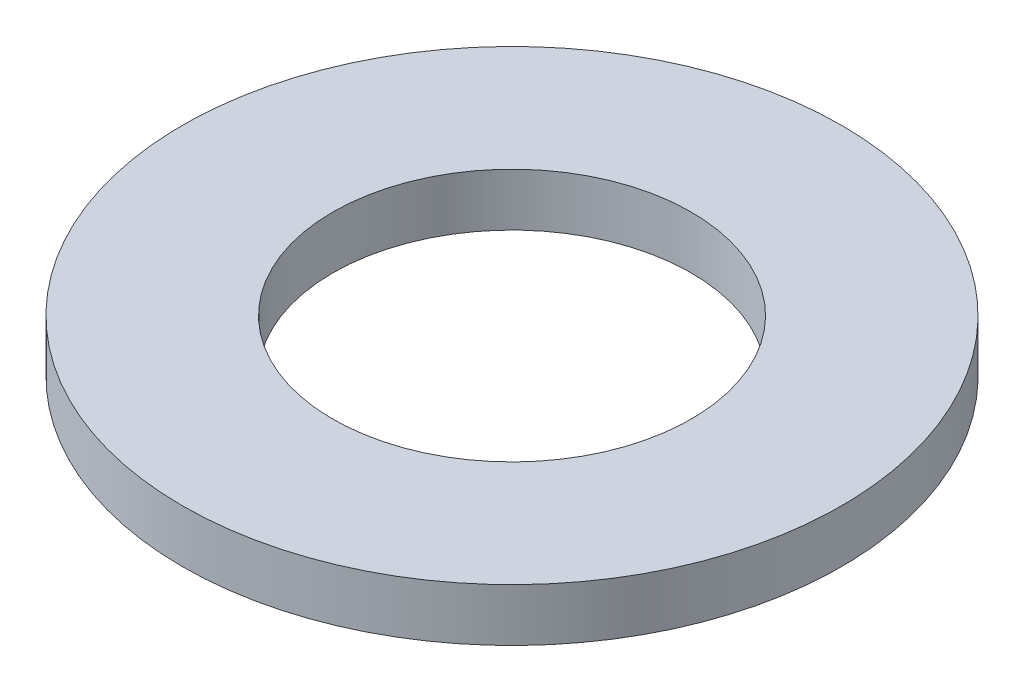
ISO-10303-21;
HEADER;
FILE_DESCRIPTION(('STEP AP214'),'2;1');
FILE_NAME('part.step','',(''),(''),'','','');
FILE_SCHEMA(('AUTOMOTIVE_DESIGN { 1 0 10303 214 1 1 1 1 }'));
ENDSEC;
DATA;
#1=APPLICATION_CONTEXT('core data for automotive mechanical design processes');
#2=APPLICATION_PROTOCOL_DEFINITION('international standard','automotive_design',2000,#1);
#3=PRODUCT_CONTEXT('',#1,'mechanical');
#4=PRODUCT('Part','Part','',(#3));
#5=PRODUCT_RELATED_PRODUCT_CATEGORY('part','',(#4));
#6=PRODUCT_DEFINITION_FORMATION('','',#4);
#7=PRODUCT_DEFINITION_CONTEXT('part definition',#1,'design');
#8=PRODUCT_DEFINITION('design','',#6,#7);
#9=PRODUCT_DEFINITION_SHAPE('','',#8);
#10=(LENGTH_UNIT() NAMED_UNIT(*) SI_UNIT(.MILLI.,.METRE.));
#11=(NAMED_UNIT(*) PLANE_ANGLE_UNIT() SI_UNIT($,.RADIAN.));
#12=(NAMED_UNIT(*) SI_UNIT($,.STERADIAN.) SOLID_ANGLE_UNIT());
#13=UNCERTAINTY_MEASURE_WITH_UNIT(LENGTH_MEASURE(1.E-05),#10,'distance_accuracy_value','');
#14=(GEOMETRIC_REPRESENTATION_CONTEXT(3) GLOBAL_UNCERTAINTY_ASSIGNED_CONTEXT((#13)) GLOBAL_UNIT_ASSIGNED_CONTEXT((#10,
#11,#12)) REPRESENTATION_CONTEXT('',''));
#15=CARTESIAN_POINT('',(0.,0.,0.));
#16=DIRECTION('',(0.,0.,1.));
#17=DIRECTION('',(1.,0.,0.));
#18=AXIS2_PLACEMENT_3D('',#15,#16,#17);
#19=CARTESIAN_POINT('',(17.188985111808,29.2935664243214,-6.4121978535183));
#20=DIRECTION('',(0.,1.,0.));
#21=DIRECTION('',(0.,0.,1.));
#22=AXIS2_PLACEMENT_3D('',#19,#20,#21);
#23=PLANE('',#22);
#24=CARTESIAN_POINT('',(16.325385111808,29.2935664243214,-6.4121978535183));
#25=DIRECTION('',(0.,1.,0.));
#26=DIRECTION('',(0.,0.,1.));
#27=AXIS2_PLACEMENT_3D('',#24,#25,#26);
#28=CIRCLE('',#27,1.5875);
#29=CARTESIAN_POINT('',(16.325385111808,29.2935664243214,-4.8246978535183));
#30=VERTEX_POINT('',#29);
#31=EDGE_CURVE('E31',#30,#30,#28,.T.);
#32=ORIENTED_EDGE('',*,*,#31,.F.);
#33=EDGE_LOOP('',(#32));
#34=FACE_BOUND('',#33,.T.);
#35=CARTESIAN_POINT('',(16.325385111808,29.2935664243214,-6.41219785351833));
#36=DIRECTION('',(0.,1.,0.));
#37=DIRECTION('',(-1.,0.,0.));
#38=AXIS2_PLACEMENT_3D('',#35,#36,#37);
#39=CIRCLE('',#38,0.8636);
#40=CARTESIAN_POINT('',(15.4617851118081,29.2935664243214,-6.41219785351833));
#41=VERTEX_POINT('',#40);
#42=EDGE_CURVE('E18',#41,#41,#39,.T.);
#43=ORIENTED_EDGE('',*,*,#42,.T.);
#44=EDGE_LOOP('',(#43));
#45=FACE_BOUND('',#44,.T.);
#46=ADVANCED_FACE('F15',(#34,#45),#23,.F.);
#47=CARTESIAN_POINT('',(16.325385111808,37.0561931162638,-6.41219785351833));
#48=DIRECTION('',(0.,1.,0.));
#49=DIRECTION('',(-1.,0.,0.));
#50=AXIS2_PLACEMENT_3D('',#47,#48,#49);
#51=CYLINDRICAL_SURFACE('',#50,0.8636);
#52=ORIENTED_EDGE('',*,*,#42,.F.);
#53=EDGE_LOOP('',(#52));
#54=FACE_BOUND('',#53,.T.);
#55=CARTESIAN_POINT('',(16.325385111808,29.5475664243214,-6.41219785351833));
#56=DIRECTION('',(0.,1.,0.));
#57=DIRECTION('',(-1.,0.,0.));
#58=AXIS2_PLACEMENT_3D('',#55,#56,#57);
#59=CIRCLE('',#58,0.8636);
#60=CARTESIAN_POINT('',(15.4617851118081,29.5475664243214,-6.41219785351833));
#61=VERTEX_POINT('',#60);
#62=EDGE_CURVE('E23',#61,#61,#59,.T.);
#63=ORIENTED_EDGE('',*,*,#62,.T.);
#64=EDGE_LOOP('',(#63));
#65=FACE_BOUND('',#64,.T.);
#66=ADVANCED_FACE('F41',(#54,#65),#51,.F.);
#67=CARTESIAN_POINT('',(16.325385111808,37.0561931162638,-6.41219785351833));
#68=DIRECTION('',(0.,1.,0.));
#69=DIRECTION('',(0.,0.,1.));
#70=AXIS2_PLACEMENT_3D('',#67,#68,#69);
#71=CYLINDRICAL_SURFACE('',#70,1.5875);
#72=CARTESIAN_POINT('',(16.325385111808,29.5475664243214,-6.4121978535183));
#73=DIRECTION('',(0.,1.,0.));
#74=DIRECTION('',(0.,0.,1.));
#75=AXIS2_PLACEMENT_3D('',#72,#73,#74);
#76=CIRCLE('',#75,1.5875);
#77=CARTESIAN_POINT('',(16.325385111808,29.5475664243214,-4.8246978535183));
#78=VERTEX_POINT('',#77);
#79=EDGE_CURVE('E10',#78,#78,#76,.F.);
#80=ORIENTED_EDGE('',*,*,#79,.T.);
#81=EDGE_LOOP('',(#80));
#82=FACE_BOUND('',#81,.T.);
#83=ORIENTED_EDGE('',*,*,#31,.T.);
#84=EDGE_LOOP('',(#83));
#85=FACE_BOUND('',#84,.T.);
#86=ADVANCED_FACE('F44',(#82,#85),#71,.T.);
#87=CARTESIAN_POINT('',(17.912885111808,29.5475664243214,-6.4121978535183));
#88=DIRECTION('',(0.,-1.,0.));
#89=DIRECTION('',(0.,0.,-1.));
#90=AXIS2_PLACEMENT_3D('',#87,#88,#89);
#91=PLANE('',#90);
#92=ORIENTED_EDGE('',*,*,#79,.F.);
#93=EDGE_LOOP('',(#92));
#94=FACE_BOUND('',#93,.T.);
#95=ORIENTED_EDGE('',*,*,#62,.F.);
#96=EDGE_LOOP('',(#95));
#97=FACE_BOUND('',#96,.T.);
#98=ADVANCED_FACE('F47',(#94,#97),#91,.F.);
#99=CLOSED_SHELL('',(#46,#66,#86,#98));
#100=MANIFOLD_SOLID_BREP('B1',#99);
#101=ADVANCED_BREP_SHAPE_REPRESENTATION('',(#18,#100),#14);
#102=SHAPE_DEFINITION_REPRESENTATION(#9,#101);
ENDSEC;
END-ISO-10303-21;
